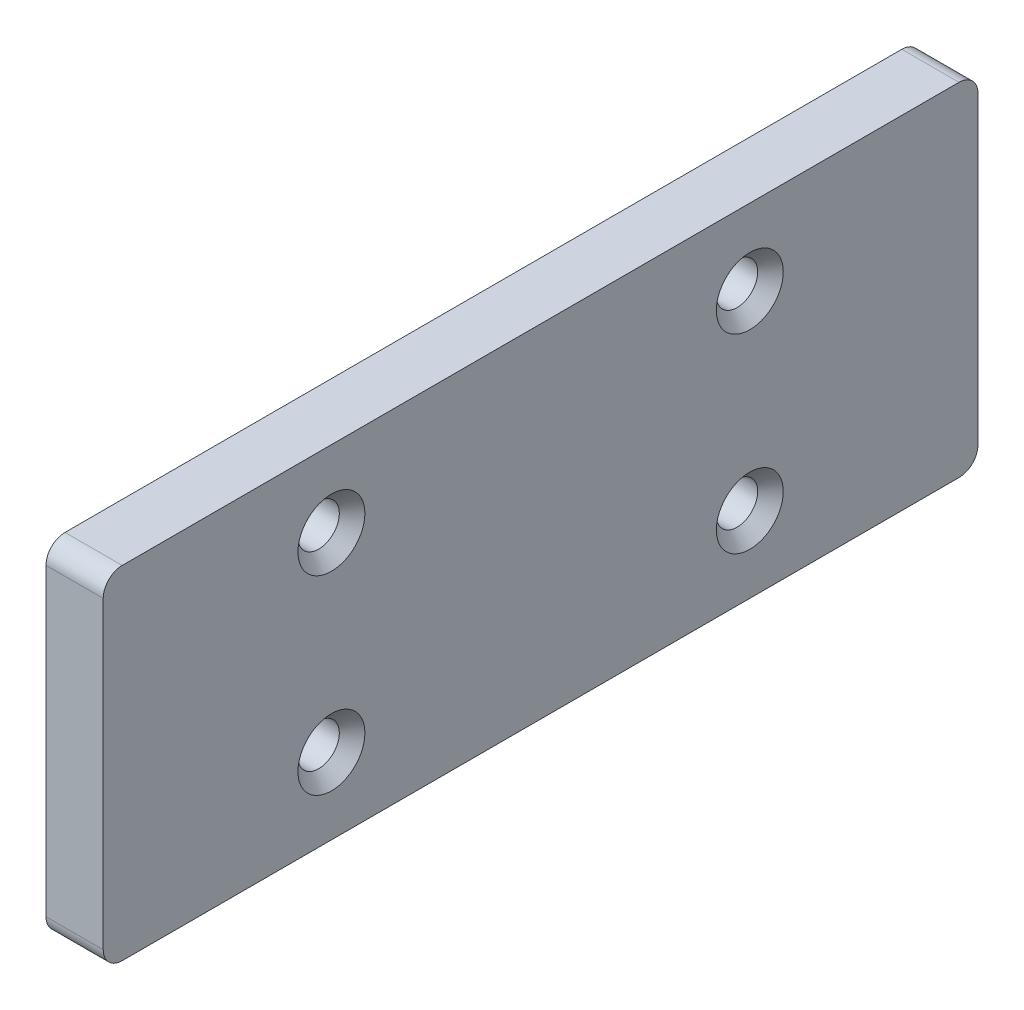
ISO-10303-21;
HEADER;
FILE_DESCRIPTION(('STEP AP214'),'2;1');
FILE_NAME('part.step','',(''),(''),'','','');
FILE_SCHEMA(('AUTOMOTIVE_DESIGN { 1 0 10303 214 1 1 1 1 }'));
ENDSEC;
DATA;
#1=APPLICATION_CONTEXT('core data for automotive mechanical design processes');
#2=APPLICATION_PROTOCOL_DEFINITION('international standard','automotive_design',2000,#1);
#3=PRODUCT_CONTEXT('',#1,'mechanical');
#4=PRODUCT('Part','Part','',(#3));
#5=PRODUCT_RELATED_PRODUCT_CATEGORY('part','',(#4));
#6=PRODUCT_DEFINITION_FORMATION('','',#4);
#7=PRODUCT_DEFINITION_CONTEXT('part definition',#1,'design');
#8=PRODUCT_DEFINITION('design','',#6,#7);
#9=PRODUCT_DEFINITION_SHAPE('','',#8);
#10=(LENGTH_UNIT() NAMED_UNIT(*) SI_UNIT(.MILLI.,.METRE.));
#11=(NAMED_UNIT(*) PLANE_ANGLE_UNIT() SI_UNIT($,.RADIAN.));
#12=(NAMED_UNIT(*) SI_UNIT($,.STERADIAN.) SOLID_ANGLE_UNIT());
#13=UNCERTAINTY_MEASURE_WITH_UNIT(LENGTH_MEASURE(1.E-05),#10,'distance_accuracy_value','');
#14=(GEOMETRIC_REPRESENTATION_CONTEXT(3) GLOBAL_UNCERTAINTY_ASSIGNED_CONTEXT((#13)) GLOBAL_UNIT_ASSIGNED_CONTEXT((#10,
#11,#12)) REPRESENTATION_CONTEXT('',''));
#15=CARTESIAN_POINT('',(0.,0.,0.));
#16=DIRECTION('',(0.,0.,1.));
#17=DIRECTION('',(1.,0.,0.));
#18=AXIS2_PLACEMENT_3D('',#15,#16,#17);
#19=CARTESIAN_POINT('',(-4.7752,14.2875,36.5125));
#20=DIRECTION('',(0.,0.,1.));
#21=DIRECTION('',(0.,-1.,0.));
#22=AXIS2_PLACEMENT_3D('',#19,#20,#21);
#23=PLANE('',#22);
#24=DIRECTION('',(0.,-1.,0.));
#25=VECTOR('',#24,1.);
#26=CARTESIAN_POINT('',(0.,14.2875,36.5125));
#27=LINE('',#26,#25);
#28=CARTESIAN_POINT('',(0.,12.7,36.5125));
#29=VERTEX_POINT('',#28);
#30=CARTESIAN_POINT('',(0.,-12.7,36.5125));
#31=VERTEX_POINT('',#30);
#32=EDGE_CURVE('E163',#29,#31,#27,.T.);
#33=ORIENTED_EDGE('',*,*,#32,.F.);
#34=DIRECTION('',(1.,0.,0.));
#35=VECTOR('',#34,1.);
#36=CARTESIAN_POINT('',(-4.7752,12.7,36.5125));
#37=LINE('',#36,#35);
#38=CARTESIAN_POINT('',(-4.7752,12.7,36.5125));
#39=VERTEX_POINT('',#38);
#40=EDGE_CURVE('E11',#29,#39,#37,.F.);
#41=ORIENTED_EDGE('',*,*,#40,.T.);
#42=DIRECTION('',(0.,-1.,0.));
#43=VECTOR('',#42,1.);
#44=CARTESIAN_POINT('',(-4.7752,14.2875,36.5125));
#45=LINE('',#44,#43);
#46=CARTESIAN_POINT('',(-4.7752,-12.7,36.5125));
#47=VERTEX_POINT('',#46);
#48=EDGE_CURVE('E166',#39,#47,#45,.T.);
#49=ORIENTED_EDGE('',*,*,#48,.T.);
#50=DIRECTION('',(1.,0.,0.));
#51=VECTOR('',#50,1.);
#52=CARTESIAN_POINT('',(-4.7752,-12.7,36.5125));
#53=LINE('',#52,#51);
#54=EDGE_CURVE('E46',#47,#31,#53,.T.);
#55=ORIENTED_EDGE('',*,*,#54,.T.);
#56=EDGE_LOOP('',(#33,#41,#49,#55));
#57=FACE_BOUND('',#56,.T.);
#58=ADVANCED_FACE('F38',(#57),#23,.T.);
#59=CARTESIAN_POINT('',(-4.7752,14.2875,36.5125));
#60=DIRECTION('',(0.,1.,0.));
#61=DIRECTION('',(0.,0.,1.));
#62=AXIS2_PLACEMENT_3D('',#59,#60,#61);
#63=PLANE('',#62);
#64=DIRECTION('',(0.,0.,1.));
#65=VECTOR('',#64,1.);
#66=CARTESIAN_POINT('',(0.,14.2875,36.5125));
#67=LINE('',#66,#65);
#68=CARTESIAN_POINT('',(0.,14.2875,-34.925));
#69=VERTEX_POINT('',#68);
#70=CARTESIAN_POINT('',(0.,14.2875,34.925));
#71=VERTEX_POINT('',#70);
#72=EDGE_CURVE('E125',#69,#71,#67,.T.);
#73=ORIENTED_EDGE('',*,*,#72,.F.);
#74=DIRECTION('',(1.,0.,0.));
#75=VECTOR('',#74,1.);
#76=CARTESIAN_POINT('',(-4.7752,14.2875,-34.925));
#77=LINE('',#76,#75);
#78=CARTESIAN_POINT('',(-4.7752,14.2875,-34.925));
#79=VERTEX_POINT('',#78);
#80=EDGE_CURVE('E146',#69,#79,#77,.F.);
#81=ORIENTED_EDGE('',*,*,#80,.T.);
#82=DIRECTION('',(0.,0.,1.));
#83=VECTOR('',#82,1.);
#84=CARTESIAN_POINT('',(-4.7752,14.2875,36.5125));
#85=LINE('',#84,#83);
#86=CARTESIAN_POINT('',(-4.7752,14.2875,34.925));
#87=VERTEX_POINT('',#86);
#88=EDGE_CURVE('E128',#79,#87,#85,.T.);
#89=ORIENTED_EDGE('',*,*,#88,.T.);
#90=DIRECTION('',(1.,0.,0.));
#91=VECTOR('',#90,1.);
#92=CARTESIAN_POINT('',(-4.7752,14.2875,34.925));
#93=LINE('',#92,#91);
#94=EDGE_CURVE('E143',#87,#71,#93,.T.);
#95=ORIENTED_EDGE('',*,*,#94,.T.);
#96=EDGE_LOOP('',(#73,#81,#89,#95));
#97=FACE_BOUND('',#96,.T.);
#98=ADVANCED_FACE('F282',(#97),#63,.T.);
#99=CARTESIAN_POINT('',(-4.7752,14.2875,-36.5125));
#100=DIRECTION('',(0.,0.,-1.));
#101=DIRECTION('',(0.,1.,0.));
#102=AXIS2_PLACEMENT_3D('',#99,#100,#101);
#103=PLANE('',#102);
#104=DIRECTION('',(0.,1.,0.));
#105=VECTOR('',#104,1.);
#106=CARTESIAN_POINT('',(-4.7752,14.2875,-36.5125));
#107=LINE('',#106,#105);
#108=CARTESIAN_POINT('',(-4.7752,-12.7,-36.5125));
#109=VERTEX_POINT('',#108);
#110=CARTESIAN_POINT('',(-4.7752,12.7,-36.5125));
#111=VERTEX_POINT('',#110);
#112=EDGE_CURVE('E133',#109,#111,#107,.T.);
#113=ORIENTED_EDGE('',*,*,#112,.T.);
#114=DIRECTION('',(1.,0.,0.));
#115=VECTOR('',#114,1.);
#116=CARTESIAN_POINT('',(-4.7752,12.7,-36.5125));
#117=LINE('',#116,#115);
#118=CARTESIAN_POINT('',(0.,12.7,-36.5125));
#119=VERTEX_POINT('',#118);
#120=EDGE_CURVE('E123',#111,#119,#117,.T.);
#121=ORIENTED_EDGE('',*,*,#120,.T.);
#122=DIRECTION('',(0.,1.,0.));
#123=VECTOR('',#122,1.);
#124=CARTESIAN_POINT('',(0.,14.2875,-36.5125));
#125=LINE('',#124,#123);
#126=CARTESIAN_POINT('',(0.,-12.7,-36.5125));
#127=VERTEX_POINT('',#126);
#128=EDGE_CURVE('E107',#127,#119,#125,.T.);
#129=ORIENTED_EDGE('',*,*,#128,.F.);
#130=DIRECTION('',(1.,0.,0.));
#131=VECTOR('',#130,1.);
#132=CARTESIAN_POINT('',(-4.7752,-12.7,-36.5125));
#133=LINE('',#132,#131);
#134=EDGE_CURVE('E121',#127,#109,#133,.F.);
#135=ORIENTED_EDGE('',*,*,#134,.T.);
#136=EDGE_LOOP('',(#113,#121,#129,#135));
#137=FACE_BOUND('',#136,.T.);
#138=ADVANCED_FACE('F120',(#137),#103,.T.);
#139=CARTESIAN_POINT('',(-4.7752,-14.2875,36.5125));
#140=DIRECTION('',(0.,-1.,0.));
#141=DIRECTION('',(0.,0.,-1.));
#142=AXIS2_PLACEMENT_3D('',#139,#140,#141);
#143=PLANE('',#142);
#144=DIRECTION('',(0.,0.,-1.));
#145=VECTOR('',#144,1.);
#146=CARTESIAN_POINT('',(-4.7752,-14.2875,36.5125));
#147=LINE('',#146,#145);
#148=CARTESIAN_POINT('',(-4.7752,-14.2875,34.925));
#149=VERTEX_POINT('',#148);
#150=CARTESIAN_POINT('',(-4.7752,-14.2875,-34.925));
#151=VERTEX_POINT('',#150);
#152=EDGE_CURVE('E180',#149,#151,#147,.T.);
#153=ORIENTED_EDGE('',*,*,#152,.T.);
#154=DIRECTION('',(1.,0.,0.));
#155=VECTOR('',#154,1.);
#156=CARTESIAN_POINT('',(-4.7752,-14.2875,-34.925));
#157=LINE('',#156,#155);
#158=CARTESIAN_POINT('',(0.,-14.2875,-34.925));
#159=VERTEX_POINT('',#158);
#160=EDGE_CURVE('E156',#151,#159,#157,.T.);
#161=ORIENTED_EDGE('',*,*,#160,.T.);
#162=DIRECTION('',(0.,0.,-1.));
#163=VECTOR('',#162,1.);
#164=CARTESIAN_POINT('',(0.,-14.2875,36.5125));
#165=LINE('',#164,#163);
#166=CARTESIAN_POINT('',(0.,-14.2875,34.925));
#167=VERTEX_POINT('',#166);
#168=EDGE_CURVE('E108',#167,#159,#165,.T.);
#169=ORIENTED_EDGE('',*,*,#168,.F.);
#170=DIRECTION('',(1.,0.,0.));
#171=VECTOR('',#170,1.);
#172=CARTESIAN_POINT('',(-4.7752,-14.2875,34.925));
#173=LINE('',#172,#171);
#174=EDGE_CURVE('E60',#167,#149,#173,.F.);
#175=ORIENTED_EDGE('',*,*,#174,.T.);
#176=EDGE_LOOP('',(#153,#161,#169,#175));
#177=FACE_BOUND('',#176,.T.);
#178=ADVANCED_FACE('F291',(#177),#143,.T.);
#179=CARTESIAN_POINT('',(-4.7752,-14.2875,36.5125));
#180=DIRECTION('',(1.,0.,0.));
#181=DIRECTION('',(0.,0.,-1.));
#182=AXIS2_PLACEMENT_3D('',#179,#180,#181);
#183=PLANE('',#182);
#184=CARTESIAN_POINT('',(-4.7752,-7.9502,-17.4625));
#185=DIRECTION('',(1.,0.,0.));
#186=DIRECTION('',(0.,0.,-1.));
#187=AXIS2_PLACEMENT_3D('',#184,#185,#186);
#188=CIRCLE('',#187,2.286);
#189=CARTESIAN_POINT('',(-4.7752,-7.9502,-19.7485));
#190=VERTEX_POINT('',#189);
#191=EDGE_CURVE('E228',#190,#190,#188,.T.);
#192=ORIENTED_EDGE('',*,*,#191,.T.);
#193=EDGE_LOOP('',(#192));
#194=FACE_BOUND('',#193,.T.);
#195=CARTESIAN_POINT('',(-4.7752,7.9248,-17.4625));
#196=DIRECTION('',(1.,0.,0.));
#197=DIRECTION('',(0.,0.,-1.));
#198=AXIS2_PLACEMENT_3D('',#195,#196,#197);
#199=CIRCLE('',#198,2.286);
#200=CARTESIAN_POINT('',(-4.7752,7.9248,-19.7485));
#201=VERTEX_POINT('',#200);
#202=EDGE_CURVE('E215',#201,#201,#199,.T.);
#203=ORIENTED_EDGE('',*,*,#202,.T.);
#204=EDGE_LOOP('',(#203));
#205=FACE_BOUND('',#204,.T.);
#206=CARTESIAN_POINT('',(-4.7752,7.9248,17.4625));
#207=DIRECTION('',(1.,0.,0.));
#208=DIRECTION('',(0.,0.,-1.));
#209=AXIS2_PLACEMENT_3D('',#206,#207,#208);
#210=CIRCLE('',#209,2.286);
#211=CARTESIAN_POINT('',(-4.7752,7.9248,15.1765));
#212=VERTEX_POINT('',#211);
#213=EDGE_CURVE('E202',#212,#212,#210,.T.);
#214=ORIENTED_EDGE('',*,*,#213,.T.);
#215=EDGE_LOOP('',(#214));
#216=FACE_BOUND('',#215,.T.);
#217=CARTESIAN_POINT('',(-4.7752,-7.9502,17.4625));
#218=DIRECTION('',(1.,0.,0.));
#219=DIRECTION('',(0.,0.,-1.));
#220=AXIS2_PLACEMENT_3D('',#217,#218,#219);
#221=CIRCLE('',#220,2.286);
#222=CARTESIAN_POINT('',(-4.7752,-7.9502,15.1765));
#223=VERTEX_POINT('',#222);
#224=EDGE_CURVE('E189',#223,#223,#221,.T.);
#225=ORIENTED_EDGE('',*,*,#224,.T.);
#226=EDGE_LOOP('',(#225));
#227=FACE_BOUND('',#226,.T.);
#228=ORIENTED_EDGE('',*,*,#88,.F.);
#229=CARTESIAN_POINT('',(-4.7752,12.7,-34.925));
#230=DIRECTION('',(1.,0.,0.));
#231=DIRECTION('',(0.,0.,-1.));
#232=AXIS2_PLACEMENT_3D('',#229,#230,#231);
#233=CIRCLE('',#232,1.5875);
#234=EDGE_CURVE('E153',#79,#111,#233,.F.);
#235=ORIENTED_EDGE('',*,*,#234,.T.);
#236=ORIENTED_EDGE('',*,*,#112,.F.);
#237=CARTESIAN_POINT('',(-4.7752,-12.7,-34.925));
#238=DIRECTION('',(1.,0.,0.));
#239=DIRECTION('',(0.,0.,-1.));
#240=AXIS2_PLACEMENT_3D('',#237,#238,#239);
#241=CIRCLE('',#240,1.5875);
#242=EDGE_CURVE('E53',#109,#151,#241,.F.);
#243=ORIENTED_EDGE('',*,*,#242,.T.);
#244=ORIENTED_EDGE('',*,*,#152,.F.);
#245=CARTESIAN_POINT('',(-4.7752,-12.7,34.925));
#246=DIRECTION('',(1.,0.,0.));
#247=DIRECTION('',(0.,0.,-1.));
#248=AXIS2_PLACEMENT_3D('',#245,#246,#247);
#249=CIRCLE('',#248,1.5875);
#250=EDGE_CURVE('E148',#149,#47,#249,.F.);
#251=ORIENTED_EDGE('',*,*,#250,.T.);
#252=ORIENTED_EDGE('',*,*,#48,.F.);
#253=CARTESIAN_POINT('',(-4.7752,12.7,34.925));
#254=DIRECTION('',(1.,0.,0.));
#255=DIRECTION('',(0.,0.,-1.));
#256=AXIS2_PLACEMENT_3D('',#253,#254,#255);
#257=CIRCLE('',#256,1.5875);
#258=EDGE_CURVE('E150',#39,#87,#257,.F.);
#259=ORIENTED_EDGE('',*,*,#258,.T.);
#260=EDGE_LOOP('',(#228,#235,#236,#243,#244,#251,#252,#259));
#261=FACE_BOUND('',#260,.T.);
#262=ADVANCED_FACE('F232',(#194,#205,#216,#227,#261),#183,.F.);
#263=CARTESIAN_POINT('',(0.,-14.2875,36.5125));
#264=DIRECTION('',(1.,0.,0.));
#265=DIRECTION('',(0.,0.,-1.));
#266=AXIS2_PLACEMENT_3D('',#263,#264,#265);
#267=PLANE('',#266);
#268=CARTESIAN_POINT('',(0.,-7.9502,-17.4625));
#269=DIRECTION('',(1.,0.,0.));
#270=DIRECTION('',(0.,0.,-1.));
#271=AXIS2_PLACEMENT_3D('',#268,#269,#270);
#272=CIRCLE('',#271,2.794);
#273=CARTESIAN_POINT('',(0.,-7.9502,-20.2565));
#274=VERTEX_POINT('',#273);
#275=EDGE_CURVE('E224',#274,#274,#272,.T.);
#276=ORIENTED_EDGE('',*,*,#275,.F.);
#277=EDGE_LOOP('',(#276));
#278=FACE_BOUND('',#277,.T.);
#279=CARTESIAN_POINT('',(0.,7.9248,-17.4625));
#280=DIRECTION('',(1.,0.,0.));
#281=DIRECTION('',(0.,0.,-1.));
#282=AXIS2_PLACEMENT_3D('',#279,#280,#281);
#283=CIRCLE('',#282,2.794);
#284=CARTESIAN_POINT('',(0.,7.9248,-20.2565));
#285=VERTEX_POINT('',#284);
#286=EDGE_CURVE('E211',#285,#285,#283,.T.);
#287=ORIENTED_EDGE('',*,*,#286,.F.);
#288=EDGE_LOOP('',(#287));
#289=FACE_BOUND('',#288,.T.);
#290=CARTESIAN_POINT('',(0.,7.9248,17.4625));
#291=DIRECTION('',(1.,0.,0.));
#292=DIRECTION('',(0.,0.,-1.));
#293=AXIS2_PLACEMENT_3D('',#290,#291,#292);
#294=CIRCLE('',#293,2.794);
#295=CARTESIAN_POINT('',(0.,7.9248,14.6685));
#296=VERTEX_POINT('',#295);
#297=EDGE_CURVE('E198',#296,#296,#294,.T.);
#298=ORIENTED_EDGE('',*,*,#297,.F.);
#299=EDGE_LOOP('',(#298));
#300=FACE_BOUND('',#299,.T.);
#301=CARTESIAN_POINT('',(0.,-7.9502,17.4625));
#302=DIRECTION('',(1.,0.,0.));
#303=DIRECTION('',(0.,0.,-1.));
#304=AXIS2_PLACEMENT_3D('',#301,#302,#303);
#305=CIRCLE('',#304,2.794);
#306=CARTESIAN_POINT('',(0.,-7.9502,14.6685));
#307=VERTEX_POINT('',#306);
#308=EDGE_CURVE('E185',#307,#307,#305,.T.);
#309=ORIENTED_EDGE('',*,*,#308,.F.);
#310=EDGE_LOOP('',(#309));
#311=FACE_BOUND('',#310,.T.);
#312=ORIENTED_EDGE('',*,*,#128,.T.);
#313=CARTESIAN_POINT('',(0.,12.7,-34.925));
#314=DIRECTION('',(1.,0.,0.));
#315=DIRECTION('',(0.,0.,-1.));
#316=AXIS2_PLACEMENT_3D('',#313,#314,#315);
#317=CIRCLE('',#316,1.5875);
#318=EDGE_CURVE('E114',#119,#69,#317,.T.);
#319=ORIENTED_EDGE('',*,*,#318,.T.);
#320=ORIENTED_EDGE('',*,*,#72,.T.);
#321=CARTESIAN_POINT('',(0.,12.7,34.925));
#322=DIRECTION('',(1.,0.,0.));
#323=DIRECTION('',(0.,0.,-1.));
#324=AXIS2_PLACEMENT_3D('',#321,#322,#323);
#325=CIRCLE('',#324,1.5875);
#326=EDGE_CURVE('E115',#71,#29,#325,.T.);
#327=ORIENTED_EDGE('',*,*,#326,.T.);
#328=ORIENTED_EDGE('',*,*,#32,.T.);
#329=CARTESIAN_POINT('',(0.,-12.7,34.925));
#330=DIRECTION('',(1.,0.,0.));
#331=DIRECTION('',(0.,0.,-1.));
#332=AXIS2_PLACEMENT_3D('',#329,#330,#331);
#333=CIRCLE('',#332,1.5875);
#334=EDGE_CURVE('E130',#31,#167,#333,.T.);
#335=ORIENTED_EDGE('',*,*,#334,.T.);
#336=ORIENTED_EDGE('',*,*,#168,.T.);
#337=CARTESIAN_POINT('',(0.,-12.7,-34.925));
#338=DIRECTION('',(1.,0.,0.));
#339=DIRECTION('',(0.,0.,-1.));
#340=AXIS2_PLACEMENT_3D('',#337,#338,#339);
#341=CIRCLE('',#340,1.5875);
#342=EDGE_CURVE('E104',#159,#127,#341,.T.);
#343=ORIENTED_EDGE('',*,*,#342,.T.);
#344=EDGE_LOOP('',(#312,#319,#320,#327,#328,#335,#336,#343));
#345=FACE_BOUND('',#344,.T.);
#346=ADVANCED_FACE('F106',(#278,#289,#300,#311,#345),#267,.T.);
#347=CARTESIAN_POINT('',(-4.2164,-7.9502,17.4625));
#348=DIRECTION('',(-1.,0.,0.));
#349=DIRECTION('',(0.,0.,1.));
#350=AXIS2_PLACEMENT_3D('',#347,#348,#349);
#351=CONICAL_SURFACE('',#350,1.7272,0.785398163397448);
#352=ORIENTED_EDGE('',*,*,#224,.F.);
#353=EDGE_LOOP('',(#352));
#354=FACE_BOUND('',#353,.T.);
#355=CARTESIAN_POINT('',(-4.2164,-7.9502,17.4625));
#356=DIRECTION('',(1.,0.,0.));
#357=DIRECTION('',(0.,0.,-1.));
#358=AXIS2_PLACEMENT_3D('',#355,#356,#357);
#359=CIRCLE('',#358,1.7272);
#360=CARTESIAN_POINT('',(-4.2164,-7.9502,15.7353));
#361=VERTEX_POINT('',#360);
#362=EDGE_CURVE('E171',#361,#361,#359,.T.);
#363=ORIENTED_EDGE('',*,*,#362,.T.);
#364=EDGE_LOOP('',(#363));
#365=FACE_BOUND('',#364,.T.);
#366=ADVANCED_FACE('F257',(#354,#365),#351,.F.);
#367=CARTESIAN_POINT('',(0.,-7.9502,17.4625));
#368=DIRECTION('',(1.,0.,0.));
#369=DIRECTION('',(0.,0.,-1.));
#370=AXIS2_PLACEMENT_3D('',#367,#368,#369);
#371=CYLINDRICAL_SURFACE('',#370,1.7272);
#372=ORIENTED_EDGE('',*,*,#362,.F.);
#373=EDGE_LOOP('',(#372));
#374=FACE_BOUND('',#373,.T.);
#375=CARTESIAN_POINT('',(-1.0668,-7.9502,17.4625));
#376=DIRECTION('',(1.,0.,0.));
#377=DIRECTION('',(0.,0.,-1.));
#378=AXIS2_PLACEMENT_3D('',#375,#376,#377);
#379=CIRCLE('',#378,1.7272);
#380=CARTESIAN_POINT('',(-1.0668,-7.9502,15.7353));
#381=VERTEX_POINT('',#380);
#382=EDGE_CURVE('E176',#381,#381,#379,.T.);
#383=ORIENTED_EDGE('',*,*,#382,.T.);
#384=EDGE_LOOP('',(#383));
#385=FACE_BOUND('',#384,.T.);
#386=ADVANCED_FACE('F268',(#374,#385),#371,.F.);
#387=CARTESIAN_POINT('',(0.,-7.9502,17.4625));
#388=DIRECTION('',(1.,0.,0.));
#389=DIRECTION('',(0.,0.,-1.));
#390=AXIS2_PLACEMENT_3D('',#387,#388,#389);
#391=CONICAL_SURFACE('',#390,2.794,0.785398163397449);
#392=ORIENTED_EDGE('',*,*,#382,.F.);
#393=EDGE_LOOP('',(#392));
#394=FACE_BOUND('',#393,.T.);
#395=ORIENTED_EDGE('',*,*,#308,.T.);
#396=EDGE_LOOP('',(#395));
#397=FACE_BOUND('',#396,.T.);
#398=ADVANCED_FACE('F265',(#394,#397),#391,.F.);
#399=CARTESIAN_POINT('',(-4.2164,7.9248,17.4625));
#400=DIRECTION('',(-1.,0.,0.));
#401=DIRECTION('',(0.,0.,1.));
#402=AXIS2_PLACEMENT_3D('',#399,#400,#401);
#403=CONICAL_SURFACE('',#402,1.7272,0.785398163397448);
#404=ORIENTED_EDGE('',*,*,#213,.F.);
#405=EDGE_LOOP('',(#404));
#406=FACE_BOUND('',#405,.T.);
#407=CARTESIAN_POINT('',(-4.2164,7.9248,17.4625));
#408=DIRECTION('',(1.,0.,0.));
#409=DIRECTION('',(0.,0.,-1.));
#410=AXIS2_PLACEMENT_3D('',#407,#408,#409);
#411=CIRCLE('',#410,1.7272);
#412=CARTESIAN_POINT('',(-4.2164,7.9248,15.7353));
#413=VERTEX_POINT('',#412);
#414=EDGE_CURVE('E192',#413,#413,#411,.T.);
#415=ORIENTED_EDGE('',*,*,#414,.T.);
#416=EDGE_LOOP('',(#415));
#417=FACE_BOUND('',#416,.T.);
#418=ADVANCED_FACE('F267',(#406,#417),#403,.F.);
#419=CARTESIAN_POINT('',(0.,7.9248,17.4625));
#420=DIRECTION('',(1.,0.,0.));
#421=DIRECTION('',(0.,0.,-1.));
#422=AXIS2_PLACEMENT_3D('',#419,#420,#421);
#423=CYLINDRICAL_SURFACE('',#422,1.7272);
#424=ORIENTED_EDGE('',*,*,#414,.F.);
#425=EDGE_LOOP('',(#424));
#426=FACE_BOUND('',#425,.T.);
#427=CARTESIAN_POINT('',(-1.0668,7.9248,17.4625));
#428=DIRECTION('',(1.,0.,0.));
#429=DIRECTION('',(0.,0.,-1.));
#430=AXIS2_PLACEMENT_3D('',#427,#428,#429);
#431=CIRCLE('',#430,1.7272);
#432=CARTESIAN_POINT('',(-1.0668,7.9248,15.7353));
#433=VERTEX_POINT('',#432);
#434=EDGE_CURVE('E195',#433,#433,#431,.T.);
#435=ORIENTED_EDGE('',*,*,#434,.T.);
#436=EDGE_LOOP('',(#435));
#437=FACE_BOUND('',#436,.T.);
#438=ADVANCED_FACE('F275',(#426,#437),#423,.F.);
#439=CARTESIAN_POINT('',(0.,7.9248,17.4625));
#440=DIRECTION('',(1.,0.,0.));
#441=DIRECTION('',(0.,0.,-1.));
#442=AXIS2_PLACEMENT_3D('',#439,#440,#441);
#443=CONICAL_SURFACE('',#442,2.794,0.785398163397449);
#444=ORIENTED_EDGE('',*,*,#434,.F.);
#445=EDGE_LOOP('',(#444));
#446=FACE_BOUND('',#445,.T.);
#447=ORIENTED_EDGE('',*,*,#297,.T.);
#448=EDGE_LOOP('',(#447));
#449=FACE_BOUND('',#448,.T.);
#450=ADVANCED_FACE('F342',(#446,#449),#443,.F.);
#451=CARTESIAN_POINT('',(-4.2164,7.9248,-17.4625));
#452=DIRECTION('',(-1.,0.,0.));
#453=DIRECTION('',(0.,0.,1.));
#454=AXIS2_PLACEMENT_3D('',#451,#452,#453);
#455=CONICAL_SURFACE('',#454,1.7272,0.785398163397448);
#456=ORIENTED_EDGE('',*,*,#202,.F.);
#457=EDGE_LOOP('',(#456));
#458=FACE_BOUND('',#457,.T.);
#459=CARTESIAN_POINT('',(-4.2164,7.9248,-17.4625));
#460=DIRECTION('',(1.,0.,0.));
#461=DIRECTION('',(0.,0.,-1.));
#462=AXIS2_PLACEMENT_3D('',#459,#460,#461);
#463=CIRCLE('',#462,1.7272);
#464=CARTESIAN_POINT('',(-4.2164,7.9248,-19.1897));
#465=VERTEX_POINT('',#464);
#466=EDGE_CURVE('E205',#465,#465,#463,.T.);
#467=ORIENTED_EDGE('',*,*,#466,.T.);
#468=EDGE_LOOP('',(#467));
#469=FACE_BOUND('',#468,.T.);
#470=ADVANCED_FACE('F356',(#458,#469),#455,.F.);
#471=CARTESIAN_POINT('',(0.,7.9248,-17.4625));
#472=DIRECTION('',(1.,0.,0.));
#473=DIRECTION('',(0.,0.,-1.));
#474=AXIS2_PLACEMENT_3D('',#471,#472,#473);
#475=CYLINDRICAL_SURFACE('',#474,1.7272);
#476=ORIENTED_EDGE('',*,*,#466,.F.);
#477=EDGE_LOOP('',(#476));
#478=FACE_BOUND('',#477,.T.);
#479=CARTESIAN_POINT('',(-1.0668,7.9248,-17.4625));
#480=DIRECTION('',(1.,0.,0.));
#481=DIRECTION('',(0.,0.,-1.));
#482=AXIS2_PLACEMENT_3D('',#479,#480,#481);
#483=CIRCLE('',#482,1.7272);
#484=CARTESIAN_POINT('',(-1.0668,7.9248,-19.1897));
#485=VERTEX_POINT('',#484);
#486=EDGE_CURVE('E208',#485,#485,#483,.T.);
#487=ORIENTED_EDGE('',*,*,#486,.T.);
#488=EDGE_LOOP('',(#487));
#489=FACE_BOUND('',#488,.T.);
#490=ADVANCED_FACE('F351',(#478,#489),#475,.F.);
#491=CARTESIAN_POINT('',(0.,7.9248,-17.4625));
#492=DIRECTION('',(1.,0.,0.));
#493=DIRECTION('',(0.,0.,-1.));
#494=AXIS2_PLACEMENT_3D('',#491,#492,#493);
#495=CONICAL_SURFACE('',#494,2.794,0.785398163397449);
#496=ORIENTED_EDGE('',*,*,#486,.F.);
#497=EDGE_LOOP('',(#496));
#498=FACE_BOUND('',#497,.T.);
#499=ORIENTED_EDGE('',*,*,#286,.T.);
#500=EDGE_LOOP('',(#499));
#501=FACE_BOUND('',#500,.T.);
#502=ADVANCED_FACE('F239',(#498,#501),#495,.F.);
#503=CARTESIAN_POINT('',(-4.2164,-7.9502,-17.4625));
#504=DIRECTION('',(-1.,0.,0.));
#505=DIRECTION('',(0.,0.,1.));
#506=AXIS2_PLACEMENT_3D('',#503,#504,#505);
#507=CONICAL_SURFACE('',#506,1.7272,0.785398163397448);
#508=ORIENTED_EDGE('',*,*,#191,.F.);
#509=EDGE_LOOP('',(#508));
#510=FACE_BOUND('',#509,.T.);
#511=CARTESIAN_POINT('',(-4.2164,-7.9502,-17.4625));
#512=DIRECTION('',(1.,0.,0.));
#513=DIRECTION('',(0.,0.,-1.));
#514=AXIS2_PLACEMENT_3D('',#511,#512,#513);
#515=CIRCLE('',#514,1.7272);
#516=CARTESIAN_POINT('',(-4.2164,-7.9502,-19.1897));
#517=VERTEX_POINT('',#516);
#518=EDGE_CURVE('E218',#517,#517,#515,.T.);
#519=ORIENTED_EDGE('',*,*,#518,.T.);
#520=EDGE_LOOP('',(#519));
#521=FACE_BOUND('',#520,.T.);
#522=ADVANCED_FACE('F235',(#510,#521),#507,.F.);
#523=CARTESIAN_POINT('',(0.,-7.9502,-17.4625));
#524=DIRECTION('',(1.,0.,0.));
#525=DIRECTION('',(0.,0.,-1.));
#526=AXIS2_PLACEMENT_3D('',#523,#524,#525);
#527=CYLINDRICAL_SURFACE('',#526,1.7272);
#528=ORIENTED_EDGE('',*,*,#518,.F.);
#529=EDGE_LOOP('',(#528));
#530=FACE_BOUND('',#529,.T.);
#531=CARTESIAN_POINT('',(-1.0668,-7.9502,-17.4625));
#532=DIRECTION('',(1.,0.,0.));
#533=DIRECTION('',(0.,0.,-1.));
#534=AXIS2_PLACEMENT_3D('',#531,#532,#533);
#535=CIRCLE('',#534,1.7272);
#536=CARTESIAN_POINT('',(-1.0668,-7.9502,-19.1897));
#537=VERTEX_POINT('',#536);
#538=EDGE_CURVE('E221',#537,#537,#535,.T.);
#539=ORIENTED_EDGE('',*,*,#538,.T.);
#540=EDGE_LOOP('',(#539));
#541=FACE_BOUND('',#540,.T.);
#542=ADVANCED_FACE('F238',(#530,#541),#527,.F.);
#543=CARTESIAN_POINT('',(0.,-7.9502,-17.4625));
#544=DIRECTION('',(1.,0.,0.));
#545=DIRECTION('',(0.,0.,-1.));
#546=AXIS2_PLACEMENT_3D('',#543,#544,#545);
#547=CONICAL_SURFACE('',#546,2.794,0.785398163397449);
#548=ORIENTED_EDGE('',*,*,#538,.F.);
#549=EDGE_LOOP('',(#548));
#550=FACE_BOUND('',#549,.T.);
#551=ORIENTED_EDGE('',*,*,#275,.T.);
#552=EDGE_LOOP('',(#551));
#553=FACE_BOUND('',#552,.T.);
#554=ADVANCED_FACE('F245',(#550,#553),#547,.F.);
#555=CARTESIAN_POINT('',(-4.7752,12.7,-34.925));
#556=DIRECTION('',(1.,0.,0.));
#557=DIRECTION('',(0.,0.,-1.));
#558=AXIS2_PLACEMENT_3D('',#555,#556,#557);
#559=CYLINDRICAL_SURFACE('',#558,1.5875);
#560=ORIENTED_EDGE('',*,*,#234,.F.);
#561=ORIENTED_EDGE('',*,*,#80,.F.);
#562=ORIENTED_EDGE('',*,*,#318,.F.);
#563=ORIENTED_EDGE('',*,*,#120,.F.);
#564=EDGE_LOOP('',(#560,#561,#562,#563));
#565=FACE_BOUND('',#564,.T.);
#566=ADVANCED_FACE('F251',(#565),#559,.T.);
#567=CARTESIAN_POINT('',(-4.7752,-12.7,-34.925));
#568=DIRECTION('',(1.,0.,0.));
#569=DIRECTION('',(0.,0.,-1.));
#570=AXIS2_PLACEMENT_3D('',#567,#568,#569);
#571=CYLINDRICAL_SURFACE('',#570,1.5875);
#572=ORIENTED_EDGE('',*,*,#242,.F.);
#573=ORIENTED_EDGE('',*,*,#134,.F.);
#574=ORIENTED_EDGE('',*,*,#342,.F.);
#575=ORIENTED_EDGE('',*,*,#160,.F.);
#576=EDGE_LOOP('',(#572,#573,#574,#575));
#577=FACE_BOUND('',#576,.T.);
#578=ADVANCED_FACE('F127',(#577),#571,.T.);
#579=CARTESIAN_POINT('',(-4.7752,12.7,34.925));
#580=DIRECTION('',(1.,0.,0.));
#581=DIRECTION('',(0.,0.,-1.));
#582=AXIS2_PLACEMENT_3D('',#579,#580,#581);
#583=CYLINDRICAL_SURFACE('',#582,1.5875);
#584=ORIENTED_EDGE('',*,*,#258,.F.);
#585=ORIENTED_EDGE('',*,*,#40,.F.);
#586=ORIENTED_EDGE('',*,*,#326,.F.);
#587=ORIENTED_EDGE('',*,*,#94,.F.);
#588=EDGE_LOOP('',(#584,#585,#586,#587));
#589=FACE_BOUND('',#588,.T.);
#590=ADVANCED_FACE('F297',(#589),#583,.T.);
#591=CARTESIAN_POINT('',(-4.7752,-12.7,34.925));
#592=DIRECTION('',(1.,0.,0.));
#593=DIRECTION('',(0.,0.,-1.));
#594=AXIS2_PLACEMENT_3D('',#591,#592,#593);
#595=CYLINDRICAL_SURFACE('',#594,1.5875);
#596=ORIENTED_EDGE('',*,*,#250,.F.);
#597=ORIENTED_EDGE('',*,*,#174,.F.);
#598=ORIENTED_EDGE('',*,*,#334,.F.);
#599=ORIENTED_EDGE('',*,*,#54,.F.);
#600=EDGE_LOOP('',(#596,#597,#598,#599));
#601=FACE_BOUND('',#600,.T.);
#602=ADVANCED_FACE('F40',(#601),#595,.T.);
#603=CLOSED_SHELL('',(#58,#98,#138,#178,#262,#346,#366,#386,#398,#418,#438,#450,#470,#490,#502,
#522,#542,#554,#566,#578,#590,#602));
#604=MANIFOLD_SOLID_BREP('B2',#603);
#605=ADVANCED_BREP_SHAPE_REPRESENTATION('',(#18,#604),#14);
#606=SHAPE_DEFINITION_REPRESENTATION(#9,#605);
ENDSEC;
END-ISO-10303-21;
